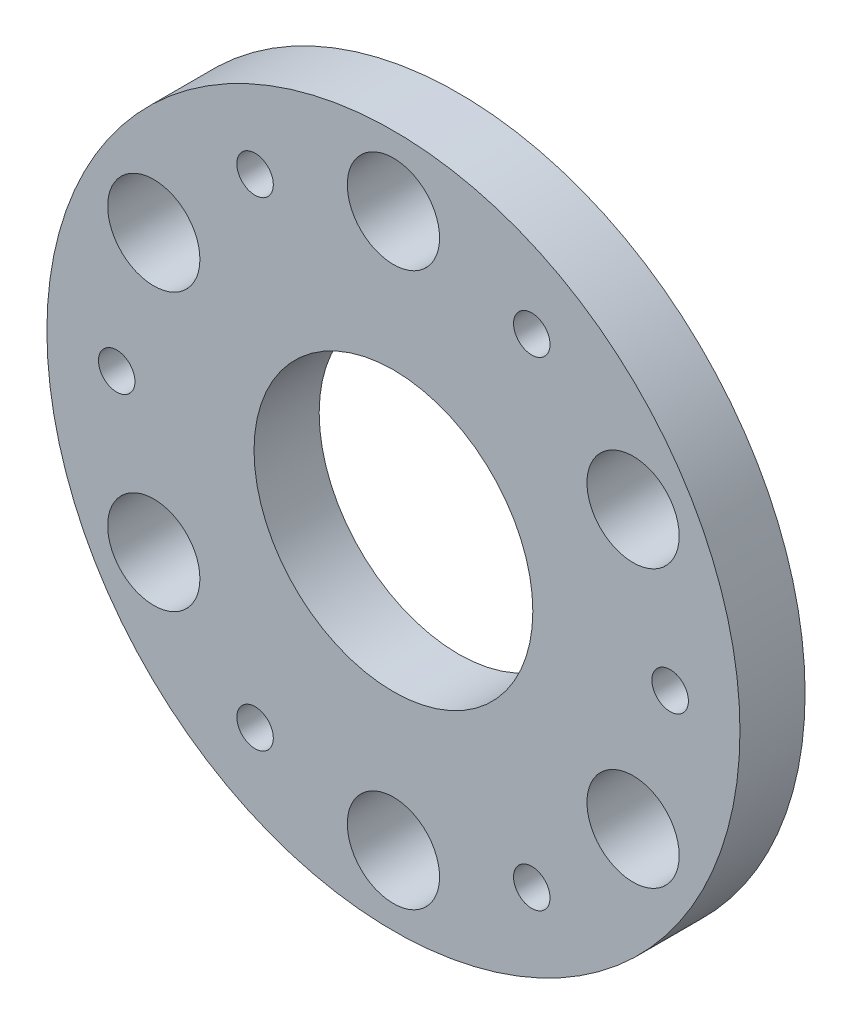
ISO-10303-21;
HEADER;
FILE_DESCRIPTION(('STEP AP214'),'2;1');
FILE_NAME('part.step','',(''),(''),'','','');
FILE_SCHEMA(('AUTOMOTIVE_DESIGN { 1 0 10303 214 1 1 1 1 }'));
ENDSEC;
DATA;
#1=APPLICATION_CONTEXT('core data for automotive mechanical design processes');
#2=APPLICATION_PROTOCOL_DEFINITION('international standard','automotive_design',2000,#1);
#3=PRODUCT_CONTEXT('',#1,'mechanical');
#4=PRODUCT('Part','Part','',(#3));
#5=PRODUCT_RELATED_PRODUCT_CATEGORY('part','',(#4));
#6=PRODUCT_DEFINITION_FORMATION('','',#4);
#7=PRODUCT_DEFINITION_CONTEXT('part definition',#1,'design');
#8=PRODUCT_DEFINITION('design','',#6,#7);
#9=PRODUCT_DEFINITION_SHAPE('','',#8);
#10=(LENGTH_UNIT() NAMED_UNIT(*) SI_UNIT(.MILLI.,.METRE.));
#11=(NAMED_UNIT(*) PLANE_ANGLE_UNIT() SI_UNIT($,.RADIAN.));
#12=(NAMED_UNIT(*) SI_UNIT($,.STERADIAN.) SOLID_ANGLE_UNIT());
#13=UNCERTAINTY_MEASURE_WITH_UNIT(LENGTH_MEASURE(1.E-05),#10,'distance_accuracy_value','');
#14=(GEOMETRIC_REPRESENTATION_CONTEXT(3) GLOBAL_UNCERTAINTY_ASSIGNED_CONTEXT((#13)) GLOBAL_UNIT_ASSIGNED_CONTEXT((#10,
#11,#12)) REPRESENTATION_CONTEXT('',''));
#15=CARTESIAN_POINT('',(0.,0.,0.));
#16=DIRECTION('',(0.,0.,1.));
#17=DIRECTION('',(1.,0.,0.));
#18=AXIS2_PLACEMENT_3D('',#15,#16,#17);
#19=CARTESIAN_POINT('',(0.,0.,3.175));
#20=DIRECTION('',(0.,0.,1.));
#21=DIRECTION('',(1.,0.,0.));
#22=AXIS2_PLACEMENT_3D('',#19,#20,#21);
#23=PLANE('',#22);
#24=CARTESIAN_POINT('',(6.74370000000014,-11.6804310310022,3.175));
#25=DIRECTION('',(0.,0.,1.));
#26=DIRECTION('',(1.,0.,0.));
#27=AXIS2_PLACEMENT_3D('',#24,#25,#26);
#28=CIRCLE('',#27,0.889);
#29=CARTESIAN_POINT('',(7.63270000000014,-11.6804310310022,3.175));
#30=VERTEX_POINT('',#29);
#31=EDGE_CURVE('E124',#30,#30,#28,.T.);
#32=ORIENTED_EDGE('',*,*,#31,.F.);
#33=EDGE_LOOP('',(#32));
#34=FACE_BOUND('',#33,.T.);
#35=CARTESIAN_POINT('',(-6.74369999999989,-11.6804310310023,3.175));
#36=DIRECTION('',(0.,0.,1.));
#37=DIRECTION('',(1.,0.,0.));
#38=AXIS2_PLACEMENT_3D('',#35,#36,#37);
#39=CIRCLE('',#38,0.889);
#40=CARTESIAN_POINT('',(-5.85469999999989,-11.6804310310023,3.175));
#41=VERTEX_POINT('',#40);
#42=EDGE_CURVE('E118',#41,#41,#39,.T.);
#43=ORIENTED_EDGE('',*,*,#42,.F.);
#44=EDGE_LOOP('',(#43));
#45=FACE_BOUND('',#44,.T.);
#46=CARTESIAN_POINT('',(-13.4874,0.,3.175));
#47=DIRECTION('',(0.,0.,1.));
#48=DIRECTION('',(1.,0.,0.));
#49=AXIS2_PLACEMENT_3D('',#46,#47,#48);
#50=CIRCLE('',#49,0.888999999999999);
#51=CARTESIAN_POINT('',(-12.5984,0.,3.175));
#52=VERTEX_POINT('',#51);
#53=EDGE_CURVE('E112',#52,#52,#50,.T.);
#54=ORIENTED_EDGE('',*,*,#53,.F.);
#55=EDGE_LOOP('',(#54));
#56=FACE_BOUND('',#55,.T.);
#57=CARTESIAN_POINT('',(-6.74370000000006,11.6804310310022,3.175));
#58=DIRECTION('',(0.,0.,1.));
#59=DIRECTION('',(1.,0.,0.));
#60=AXIS2_PLACEMENT_3D('',#57,#58,#59);
#61=CIRCLE('',#60,0.888999999999999);
#62=CARTESIAN_POINT('',(-5.85470000000006,11.6804310310022,3.175));
#63=VERTEX_POINT('',#62);
#64=EDGE_CURVE('E106',#63,#63,#61,.T.);
#65=ORIENTED_EDGE('',*,*,#64,.F.);
#66=EDGE_LOOP('',(#65));
#67=FACE_BOUND('',#66,.T.);
#68=CARTESIAN_POINT('',(6.74369999999997,11.6804310310023,3.175));
#69=DIRECTION('',(0.,0.,1.));
#70=DIRECTION('',(1.,0.,0.));
#71=AXIS2_PLACEMENT_3D('',#68,#69,#70);
#72=CIRCLE('',#71,0.889);
#73=CARTESIAN_POINT('',(7.63269999999997,11.6804310310023,3.175));
#74=VERTEX_POINT('',#73);
#75=EDGE_CURVE('E100',#74,#74,#72,.T.);
#76=ORIENTED_EDGE('',*,*,#75,.F.);
#77=EDGE_LOOP('',(#76));
#78=FACE_BOUND('',#77,.T.);
#79=CARTESIAN_POINT('',(13.4874,0.,3.175));
#80=DIRECTION('',(0.,0.,1.));
#81=DIRECTION('',(1.,0.,0.));
#82=AXIS2_PLACEMENT_3D('',#79,#80,#81);
#83=CIRCLE('',#82,0.888999999999999);
#84=CARTESIAN_POINT('',(14.3764,0.,3.175));
#85=VERTEX_POINT('',#84);
#86=EDGE_CURVE('E94',#85,#85,#83,.T.);
#87=ORIENTED_EDGE('',*,*,#86,.F.);
#88=EDGE_LOOP('',(#87));
#89=FACE_BOUND('',#88,.T.);
#90=CARTESIAN_POINT('',(0.,0.,3.175));
#91=DIRECTION('',(0.,0.,1.));
#92=DIRECTION('',(1.,0.,0.));
#93=AXIS2_PLACEMENT_3D('',#90,#91,#92);
#94=CIRCLE('',#93,6.7945);
#95=CARTESIAN_POINT('',(6.7945,0.,3.175));
#96=VERTEX_POINT('',#95);
#97=EDGE_CURVE('E88',#96,#96,#94,.T.);
#98=ORIENTED_EDGE('',*,*,#97,.F.);
#99=EDGE_LOOP('',(#98));
#100=FACE_BOUND('',#99,.T.);
#101=CARTESIAN_POINT('',(11.6804310310023,6.74369999999989,3.175));
#102=DIRECTION('',(0.,0.,1.));
#103=DIRECTION('',(1.,0.,0.));
#104=AXIS2_PLACEMENT_3D('',#101,#102,#103);
#105=CIRCLE('',#104,2.2479);
#106=CARTESIAN_POINT('',(13.9283310310023,6.74369999999989,3.175));
#107=VERTEX_POINT('',#106);
#108=EDGE_CURVE('E71',#107,#107,#105,.T.);
#109=ORIENTED_EDGE('',*,*,#108,.F.);
#110=EDGE_LOOP('',(#109));
#111=FACE_BOUND('',#110,.T.);
#112=CARTESIAN_POINT('',(-11.6804310310022,6.74370000000006,3.175));
#113=DIRECTION('',(0.,0.,1.));
#114=DIRECTION('',(1.,0.,0.));
#115=AXIS2_PLACEMENT_3D('',#112,#113,#114);
#116=CIRCLE('',#115,2.2479);
#117=CARTESIAN_POINT('',(-9.43253103100221,6.74370000000006,3.175));
#118=VERTEX_POINT('',#117);
#119=EDGE_CURVE('E59',#118,#118,#116,.T.);
#120=ORIENTED_EDGE('',*,*,#119,.F.);
#121=EDGE_LOOP('',(#120));
#122=FACE_BOUND('',#121,.T.);
#123=CARTESIAN_POINT('',(0.,-13.4874,3.175));
#124=DIRECTION('',(0.,0.,1.));
#125=DIRECTION('',(1.,0.,0.));
#126=AXIS2_PLACEMENT_3D('',#123,#124,#125);
#127=CIRCLE('',#126,2.2479);
#128=CARTESIAN_POINT('',(2.2479,-13.4874,3.175));
#129=VERTEX_POINT('',#128);
#130=EDGE_CURVE('E48',#129,#129,#127,.T.);
#131=ORIENTED_EDGE('',*,*,#130,.F.);
#132=EDGE_LOOP('',(#131));
#133=FACE_BOUND('',#132,.T.);
#134=CARTESIAN_POINT('',(0.,0.,3.175));
#135=DIRECTION('',(0.,0.,1.));
#136=DIRECTION('',(1.,0.,0.));
#137=AXIS2_PLACEMENT_3D('',#134,#135,#136);
#138=CIRCLE('',#137,16.891);
#139=CARTESIAN_POINT('',(16.891,0.,3.175));
#140=VERTEX_POINT('',#139);
#141=EDGE_CURVE('E10',#140,#140,#138,.T.);
#142=ORIENTED_EDGE('',*,*,#141,.T.);
#143=EDGE_LOOP('',(#142));
#144=FACE_BOUND('',#143,.T.);
#145=CARTESIAN_POINT('',(-11.6804310310023,-6.74369999999997,3.175));
#146=DIRECTION('',(0.,0.,1.));
#147=DIRECTION('',(1.,0.,0.));
#148=AXIS2_PLACEMENT_3D('',#145,#146,#147);
#149=CIRCLE('',#148,2.2479);
#150=CARTESIAN_POINT('',(-9.43253103100225,-6.74369999999997,3.175));
#151=VERTEX_POINT('',#150);
#152=EDGE_CURVE('E53',#151,#151,#149,.T.);
#153=ORIENTED_EDGE('',*,*,#152,.F.);
#154=EDGE_LOOP('',(#153));
#155=FACE_BOUND('',#154,.T.);
#156=CARTESIAN_POINT('',(0.,13.4874,3.175));
#157=DIRECTION('',(0.,0.,1.));
#158=DIRECTION('',(1.,0.,0.));
#159=AXIS2_PLACEMENT_3D('',#156,#157,#158);
#160=CIRCLE('',#159,2.2479);
#161=CARTESIAN_POINT('',(2.24790000000009,13.4874,3.175));
#162=VERTEX_POINT('',#161);
#163=EDGE_CURVE('E65',#162,#162,#160,.T.);
#164=ORIENTED_EDGE('',*,*,#163,.F.);
#165=EDGE_LOOP('',(#164));
#166=FACE_BOUND('',#165,.T.);
#167=CARTESIAN_POINT('',(11.6804310310022,-6.74370000000014,3.175));
#168=DIRECTION('',(0.,0.,1.));
#169=DIRECTION('',(1.,0.,0.));
#170=AXIS2_PLACEMENT_3D('',#167,#168,#169);
#171=CIRCLE('',#170,2.2479);
#172=CARTESIAN_POINT('',(13.9283310310022,-6.74370000000014,3.175));
#173=VERTEX_POINT('',#172);
#174=EDGE_CURVE('E77',#173,#173,#171,.T.);
#175=ORIENTED_EDGE('',*,*,#174,.F.);
#176=EDGE_LOOP('',(#175));
#177=FACE_BOUND('',#176,.T.);
#178=ADVANCED_FACE('F37',(#34,#45,#56,#67,#78,#89,#100,#111,#122,#133,#144,#155,#166,#177),#23,.T.);
#179=CARTESIAN_POINT('',(0.,0.,0.));
#180=DIRECTION('',(0.,0.,1.));
#181=DIRECTION('',(1.,0.,0.));
#182=AXIS2_PLACEMENT_3D('',#179,#180,#181);
#183=PLANE('',#182);
#184=CARTESIAN_POINT('',(6.74370000000014,-11.6804310310022,0.));
#185=DIRECTION('',(0.,0.,1.));
#186=DIRECTION('',(1.,0.,0.));
#187=AXIS2_PLACEMENT_3D('',#184,#185,#186);
#188=CIRCLE('',#187,0.888999999999999);
#189=CARTESIAN_POINT('',(7.63270000000014,-11.6804310310022,0.));
#190=VERTEX_POINT('',#189);
#191=EDGE_CURVE('E121',#190,#190,#188,.T.);
#192=ORIENTED_EDGE('',*,*,#191,.T.);
#193=EDGE_LOOP('',(#192));
#194=FACE_BOUND('',#193,.T.);
#195=CARTESIAN_POINT('',(-6.74369999999989,-11.6804310310023,0.));
#196=DIRECTION('',(0.,0.,1.));
#197=DIRECTION('',(1.,0.,0.));
#198=AXIS2_PLACEMENT_3D('',#195,#196,#197);
#199=CIRCLE('',#198,0.888999999999999);
#200=CARTESIAN_POINT('',(-5.85469999999989,-11.6804310310023,0.));
#201=VERTEX_POINT('',#200);
#202=EDGE_CURVE('E115',#201,#201,#199,.T.);
#203=ORIENTED_EDGE('',*,*,#202,.T.);
#204=EDGE_LOOP('',(#203));
#205=FACE_BOUND('',#204,.T.);
#206=CARTESIAN_POINT('',(-13.4874,0.,0.));
#207=DIRECTION('',(0.,0.,1.));
#208=DIRECTION('',(1.,0.,0.));
#209=AXIS2_PLACEMENT_3D('',#206,#207,#208);
#210=CIRCLE('',#209,0.888999999999999);
#211=CARTESIAN_POINT('',(-12.5984,0.,0.));
#212=VERTEX_POINT('',#211);
#213=EDGE_CURVE('E109',#212,#212,#210,.T.);
#214=ORIENTED_EDGE('',*,*,#213,.T.);
#215=EDGE_LOOP('',(#214));
#216=FACE_BOUND('',#215,.T.);
#217=CARTESIAN_POINT('',(-6.74370000000006,11.6804310310022,0.));
#218=DIRECTION('',(0.,0.,1.));
#219=DIRECTION('',(1.,0.,0.));
#220=AXIS2_PLACEMENT_3D('',#217,#218,#219);
#221=CIRCLE('',#220,0.888999999999999);
#222=CARTESIAN_POINT('',(-5.85470000000006,11.6804310310022,0.));
#223=VERTEX_POINT('',#222);
#224=EDGE_CURVE('E103',#223,#223,#221,.T.);
#225=ORIENTED_EDGE('',*,*,#224,.T.);
#226=EDGE_LOOP('',(#225));
#227=FACE_BOUND('',#226,.T.);
#228=CARTESIAN_POINT('',(6.74369999999997,11.6804310310023,0.));
#229=DIRECTION('',(0.,0.,1.));
#230=DIRECTION('',(1.,0.,0.));
#231=AXIS2_PLACEMENT_3D('',#228,#229,#230);
#232=CIRCLE('',#231,0.888999999999999);
#233=CARTESIAN_POINT('',(7.63269999999997,11.6804310310023,0.));
#234=VERTEX_POINT('',#233);
#235=EDGE_CURVE('E97',#234,#234,#232,.T.);
#236=ORIENTED_EDGE('',*,*,#235,.T.);
#237=EDGE_LOOP('',(#236));
#238=FACE_BOUND('',#237,.T.);
#239=CARTESIAN_POINT('',(13.4874,0.,0.));
#240=DIRECTION('',(0.,0.,1.));
#241=DIRECTION('',(1.,0.,0.));
#242=AXIS2_PLACEMENT_3D('',#239,#240,#241);
#243=CIRCLE('',#242,0.888999999999999);
#244=CARTESIAN_POINT('',(14.3764,0.,0.));
#245=VERTEX_POINT('',#244);
#246=EDGE_CURVE('E91',#245,#245,#243,.T.);
#247=ORIENTED_EDGE('',*,*,#246,.T.);
#248=EDGE_LOOP('',(#247));
#249=FACE_BOUND('',#248,.T.);
#250=CARTESIAN_POINT('',(0.,0.,0.));
#251=DIRECTION('',(0.,0.,1.));
#252=DIRECTION('',(1.,0.,0.));
#253=AXIS2_PLACEMENT_3D('',#250,#251,#252);
#254=CIRCLE('',#253,6.7945);
#255=CARTESIAN_POINT('',(6.7945,0.,0.));
#256=VERTEX_POINT('',#255);
#257=EDGE_CURVE('E83',#256,#256,#254,.T.);
#258=ORIENTED_EDGE('',*,*,#257,.T.);
#259=EDGE_LOOP('',(#258));
#260=FACE_BOUND('',#259,.T.);
#261=CARTESIAN_POINT('',(0.,0.,0.));
#262=DIRECTION('',(0.,0.,1.));
#263=DIRECTION('',(1.,0.,0.));
#264=AXIS2_PLACEMENT_3D('',#261,#262,#263);
#265=CIRCLE('',#264,16.891);
#266=CARTESIAN_POINT('',(16.891,0.,0.));
#267=VERTEX_POINT('',#266);
#268=EDGE_CURVE('E41',#267,#267,#265,.T.);
#269=ORIENTED_EDGE('',*,*,#268,.F.);
#270=EDGE_LOOP('',(#269));
#271=FACE_BOUND('',#270,.T.);
#272=CARTESIAN_POINT('',(0.,-13.4874,0.));
#273=DIRECTION('',(0.,0.,1.));
#274=DIRECTION('',(1.,0.,0.));
#275=AXIS2_PLACEMENT_3D('',#272,#273,#274);
#276=CIRCLE('',#275,2.2479);
#277=CARTESIAN_POINT('',(2.2479,-13.4874,0.));
#278=VERTEX_POINT('',#277);
#279=EDGE_CURVE('E50',#278,#278,#276,.T.);
#280=ORIENTED_EDGE('',*,*,#279,.T.);
#281=EDGE_LOOP('',(#280));
#282=FACE_BOUND('',#281,.T.);
#283=CARTESIAN_POINT('',(-11.6804310310023,-6.74369999999997,0.));
#284=DIRECTION('',(0.,0.,1.));
#285=DIRECTION('',(1.,0.,0.));
#286=AXIS2_PLACEMENT_3D('',#283,#284,#285);
#287=CIRCLE('',#286,2.2479);
#288=CARTESIAN_POINT('',(-9.43253103100225,-6.74369999999997,0.));
#289=VERTEX_POINT('',#288);
#290=EDGE_CURVE('E56',#289,#289,#287,.T.);
#291=ORIENTED_EDGE('',*,*,#290,.T.);
#292=EDGE_LOOP('',(#291));
#293=FACE_BOUND('',#292,.T.);
#294=CARTESIAN_POINT('',(-11.6804310310022,6.74370000000006,0.));
#295=DIRECTION('',(0.,0.,1.));
#296=DIRECTION('',(1.,0.,0.));
#297=AXIS2_PLACEMENT_3D('',#294,#295,#296);
#298=CIRCLE('',#297,2.2479);
#299=CARTESIAN_POINT('',(-9.43253103100221,6.74370000000006,0.));
#300=VERTEX_POINT('',#299);
#301=EDGE_CURVE('E62',#300,#300,#298,.T.);
#302=ORIENTED_EDGE('',*,*,#301,.T.);
#303=EDGE_LOOP('',(#302));
#304=FACE_BOUND('',#303,.T.);
#305=CARTESIAN_POINT('',(0.,13.4874,0.));
#306=DIRECTION('',(0.,0.,1.));
#307=DIRECTION('',(1.,0.,0.));
#308=AXIS2_PLACEMENT_3D('',#305,#306,#307);
#309=CIRCLE('',#308,2.2479);
#310=CARTESIAN_POINT('',(2.24790000000009,13.4874,0.));
#311=VERTEX_POINT('',#310);
#312=EDGE_CURVE('E68',#311,#311,#309,.T.);
#313=ORIENTED_EDGE('',*,*,#312,.T.);
#314=EDGE_LOOP('',(#313));
#315=FACE_BOUND('',#314,.T.);
#316=CARTESIAN_POINT('',(11.6804310310023,6.74369999999989,0.));
#317=DIRECTION('',(0.,0.,1.));
#318=DIRECTION('',(1.,0.,0.));
#319=AXIS2_PLACEMENT_3D('',#316,#317,#318);
#320=CIRCLE('',#319,2.2479);
#321=CARTESIAN_POINT('',(13.9283310310023,6.74369999999989,0.));
#322=VERTEX_POINT('',#321);
#323=EDGE_CURVE('E74',#322,#322,#320,.T.);
#324=ORIENTED_EDGE('',*,*,#323,.T.);
#325=EDGE_LOOP('',(#324));
#326=FACE_BOUND('',#325,.T.);
#327=CARTESIAN_POINT('',(11.6804310310022,-6.74370000000014,0.));
#328=DIRECTION('',(0.,0.,1.));
#329=DIRECTION('',(1.,0.,0.));
#330=AXIS2_PLACEMENT_3D('',#327,#328,#329);
#331=CIRCLE('',#330,2.2479);
#332=CARTESIAN_POINT('',(13.9283310310022,-6.74370000000014,0.));
#333=VERTEX_POINT('',#332);
#334=EDGE_CURVE('E80',#333,#333,#331,.T.);
#335=ORIENTED_EDGE('',*,*,#334,.T.);
#336=EDGE_LOOP('',(#335));
#337=FACE_BOUND('',#336,.T.);
#338=ADVANCED_FACE('F132',(#194,#205,#216,#227,#238,#249,#260,#271,#282,#293,#304,#315,#326,
#337),#183,.F.);
#339=CARTESIAN_POINT('',(0.,0.,3.175));
#340=DIRECTION('',(0.,0.,-1.));
#341=DIRECTION('',(-1.,0.,0.));
#342=AXIS2_PLACEMENT_3D('',#339,#340,#341);
#343=CYLINDRICAL_SURFACE('',#342,16.891);
#344=ORIENTED_EDGE('',*,*,#141,.F.);
#345=EDGE_LOOP('',(#344));
#346=FACE_BOUND('',#345,.T.);
#347=ORIENTED_EDGE('',*,*,#268,.T.);
#348=EDGE_LOOP('',(#347));
#349=FACE_BOUND('',#348,.T.);
#350=ADVANCED_FACE('F39',(#346,#349),#343,.T.);
#351=CARTESIAN_POINT('',(0.,-13.4874,3.175));
#352=DIRECTION('',(0.,0.,-1.));
#353=DIRECTION('',(-1.,0.,0.));
#354=AXIS2_PLACEMENT_3D('',#351,#352,#353);
#355=CYLINDRICAL_SURFACE('',#354,2.2479);
#356=ORIENTED_EDGE('',*,*,#130,.T.);
#357=EDGE_LOOP('',(#356));
#358=FACE_BOUND('',#357,.T.);
#359=ORIENTED_EDGE('',*,*,#279,.F.);
#360=EDGE_LOOP('',(#359));
#361=FACE_BOUND('',#360,.T.);
#362=ADVANCED_FACE('F172',(#358,#361),#355,.F.);
#363=CARTESIAN_POINT('',(-11.6804310310023,-6.74369999999997,3.175));
#364=DIRECTION('',(0.,0.,-1.));
#365=DIRECTION('',(-1.,0.,0.));
#366=AXIS2_PLACEMENT_3D('',#363,#364,#365);
#367=CYLINDRICAL_SURFACE('',#366,2.2479);
#368=ORIENTED_EDGE('',*,*,#152,.T.);
#369=EDGE_LOOP('',(#368));
#370=FACE_BOUND('',#369,.T.);
#371=ORIENTED_EDGE('',*,*,#290,.F.);
#372=EDGE_LOOP('',(#371));
#373=FACE_BOUND('',#372,.T.);
#374=ADVANCED_FACE('F178',(#370,#373),#367,.F.);
#375=CARTESIAN_POINT('',(-11.6804310310022,6.74370000000006,3.175));
#376=DIRECTION('',(0.,0.,-1.));
#377=DIRECTION('',(-1.,0.,0.));
#378=AXIS2_PLACEMENT_3D('',#375,#376,#377);
#379=CYLINDRICAL_SURFACE('',#378,2.2479);
#380=ORIENTED_EDGE('',*,*,#119,.T.);
#381=EDGE_LOOP('',(#380));
#382=FACE_BOUND('',#381,.T.);
#383=ORIENTED_EDGE('',*,*,#301,.F.);
#384=EDGE_LOOP('',(#383));
#385=FACE_BOUND('',#384,.T.);
#386=ADVANCED_FACE('F182',(#382,#385),#379,.F.);
#387=CARTESIAN_POINT('',(0.,13.4874,3.175));
#388=DIRECTION('',(0.,0.,-1.));
#389=DIRECTION('',(-1.,0.,0.));
#390=AXIS2_PLACEMENT_3D('',#387,#388,#389);
#391=CYLINDRICAL_SURFACE('',#390,2.2479);
#392=ORIENTED_EDGE('',*,*,#163,.T.);
#393=EDGE_LOOP('',(#392));
#394=FACE_BOUND('',#393,.T.);
#395=ORIENTED_EDGE('',*,*,#312,.F.);
#396=EDGE_LOOP('',(#395));
#397=FACE_BOUND('',#396,.T.);
#398=ADVANCED_FACE('F186',(#394,#397),#391,.F.);
#399=CARTESIAN_POINT('',(11.6804310310023,6.74369999999989,3.175));
#400=DIRECTION('',(0.,0.,-1.));
#401=DIRECTION('',(-1.,0.,0.));
#402=AXIS2_PLACEMENT_3D('',#399,#400,#401);
#403=CYLINDRICAL_SURFACE('',#402,2.2479);
#404=ORIENTED_EDGE('',*,*,#108,.T.);
#405=EDGE_LOOP('',(#404));
#406=FACE_BOUND('',#405,.T.);
#407=ORIENTED_EDGE('',*,*,#323,.F.);
#408=EDGE_LOOP('',(#407));
#409=FACE_BOUND('',#408,.T.);
#410=ADVANCED_FACE('F162',(#406,#409),#403,.F.);
#411=CARTESIAN_POINT('',(11.6804310310022,-6.74370000000014,3.175));
#412=DIRECTION('',(0.,0.,-1.));
#413=DIRECTION('',(-1.,0.,0.));
#414=AXIS2_PLACEMENT_3D('',#411,#412,#413);
#415=CYLINDRICAL_SURFACE('',#414,2.2479);
#416=ORIENTED_EDGE('',*,*,#174,.T.);
#417=EDGE_LOOP('',(#416));
#418=FACE_BOUND('',#417,.T.);
#419=ORIENTED_EDGE('',*,*,#334,.F.);
#420=EDGE_LOOP('',(#419));
#421=FACE_BOUND('',#420,.T.);
#422=ADVANCED_FACE('F158',(#418,#421),#415,.F.);
#423=CARTESIAN_POINT('',(0.,0.,3.175));
#424=DIRECTION('',(0.,0.,1.));
#425=DIRECTION('',(1.,0.,0.));
#426=AXIS2_PLACEMENT_3D('',#423,#424,#425);
#427=CYLINDRICAL_SURFACE('',#426,6.7945);
#428=ORIENTED_EDGE('',*,*,#257,.F.);
#429=EDGE_LOOP('',(#428));
#430=FACE_BOUND('',#429,.T.);
#431=ORIENTED_EDGE('',*,*,#97,.T.);
#432=EDGE_LOOP('',(#431));
#433=FACE_BOUND('',#432,.T.);
#434=ADVANCED_FACE('F161',(#430,#433),#427,.F.);
#435=CARTESIAN_POINT('',(13.4874,0.,3.175));
#436=DIRECTION('',(0.,0.,1.));
#437=DIRECTION('',(1.,0.,0.));
#438=AXIS2_PLACEMENT_3D('',#435,#436,#437);
#439=CYLINDRICAL_SURFACE('',#438,0.888999999999999);
#440=ORIENTED_EDGE('',*,*,#246,.F.);
#441=EDGE_LOOP('',(#440));
#442=FACE_BOUND('',#441,.T.);
#443=ORIENTED_EDGE('',*,*,#86,.T.);
#444=EDGE_LOOP('',(#443));
#445=FACE_BOUND('',#444,.T.);
#446=ADVANCED_FACE('F196',(#442,#445),#439,.F.);
#447=CARTESIAN_POINT('',(6.74369999999997,11.6804310310023,3.175));
#448=DIRECTION('',(0.,0.,1.));
#449=DIRECTION('',(1.,0.,0.));
#450=AXIS2_PLACEMENT_3D('',#447,#448,#449);
#451=CYLINDRICAL_SURFACE('',#450,0.889);
#452=ORIENTED_EDGE('',*,*,#235,.F.);
#453=EDGE_LOOP('',(#452));
#454=FACE_BOUND('',#453,.T.);
#455=ORIENTED_EDGE('',*,*,#75,.T.);
#456=EDGE_LOOP('',(#455));
#457=FACE_BOUND('',#456,.T.);
#458=ADVANCED_FACE('F200',(#454,#457),#451,.F.);
#459=CARTESIAN_POINT('',(-6.74370000000006,11.6804310310022,3.175));
#460=DIRECTION('',(0.,0.,1.));
#461=DIRECTION('',(1.,0.,0.));
#462=AXIS2_PLACEMENT_3D('',#459,#460,#461);
#463=CYLINDRICAL_SURFACE('',#462,0.888999999999999);
#464=ORIENTED_EDGE('',*,*,#224,.F.);
#465=EDGE_LOOP('',(#464));
#466=FACE_BOUND('',#465,.T.);
#467=ORIENTED_EDGE('',*,*,#64,.T.);
#468=EDGE_LOOP('',(#467));
#469=FACE_BOUND('',#468,.T.);
#470=ADVANCED_FACE('F203',(#466,#469),#463,.F.);
#471=CARTESIAN_POINT('',(-13.4874,0.,3.175));
#472=DIRECTION('',(0.,0.,1.));
#473=DIRECTION('',(1.,0.,0.));
#474=AXIS2_PLACEMENT_3D('',#471,#472,#473);
#475=CYLINDRICAL_SURFACE('',#474,0.888999999999999);
#476=ORIENTED_EDGE('',*,*,#213,.F.);
#477=EDGE_LOOP('',(#476));
#478=FACE_BOUND('',#477,.T.);
#479=ORIENTED_EDGE('',*,*,#53,.T.);
#480=EDGE_LOOP('',(#479));
#481=FACE_BOUND('',#480,.T.);
#482=ADVANCED_FACE('F207',(#478,#481),#475,.F.);
#483=CARTESIAN_POINT('',(-6.74369999999989,-11.6804310310023,3.175));
#484=DIRECTION('',(0.,0.,1.));
#485=DIRECTION('',(1.,0.,0.));
#486=AXIS2_PLACEMENT_3D('',#483,#484,#485);
#487=CYLINDRICAL_SURFACE('',#486,0.889);
#488=ORIENTED_EDGE('',*,*,#202,.F.);
#489=EDGE_LOOP('',(#488));
#490=FACE_BOUND('',#489,.T.);
#491=ORIENTED_EDGE('',*,*,#42,.T.);
#492=EDGE_LOOP('',(#491));
#493=FACE_BOUND('',#492,.T.);
#494=ADVANCED_FACE('F211',(#490,#493),#487,.F.);
#495=CARTESIAN_POINT('',(6.74370000000014,-11.6804310310022,3.175));
#496=DIRECTION('',(0.,0.,1.));
#497=DIRECTION('',(1.,0.,0.));
#498=AXIS2_PLACEMENT_3D('',#495,#496,#497);
#499=CYLINDRICAL_SURFACE('',#498,0.889);
#500=ORIENTED_EDGE('',*,*,#191,.F.);
#501=EDGE_LOOP('',(#500));
#502=FACE_BOUND('',#501,.T.);
#503=ORIENTED_EDGE('',*,*,#31,.T.);
#504=EDGE_LOOP('',(#503));
#505=FACE_BOUND('',#504,.T.);
#506=ADVANCED_FACE('F128',(#502,#505),#499,.F.);
#507=CLOSED_SHELL('',(#178,#338,#350,#362,#374,#386,#398,#410,#422,#434,#446,#458,#470,#482,
#494,#506));
#508=MANIFOLD_SOLID_BREP('B2',#507);
#509=ADVANCED_BREP_SHAPE_REPRESENTATION('',(#18,#508),#14);
#510=SHAPE_DEFINITION_REPRESENTATION(#9,#509);
ENDSEC;
END-ISO-10303-21;
